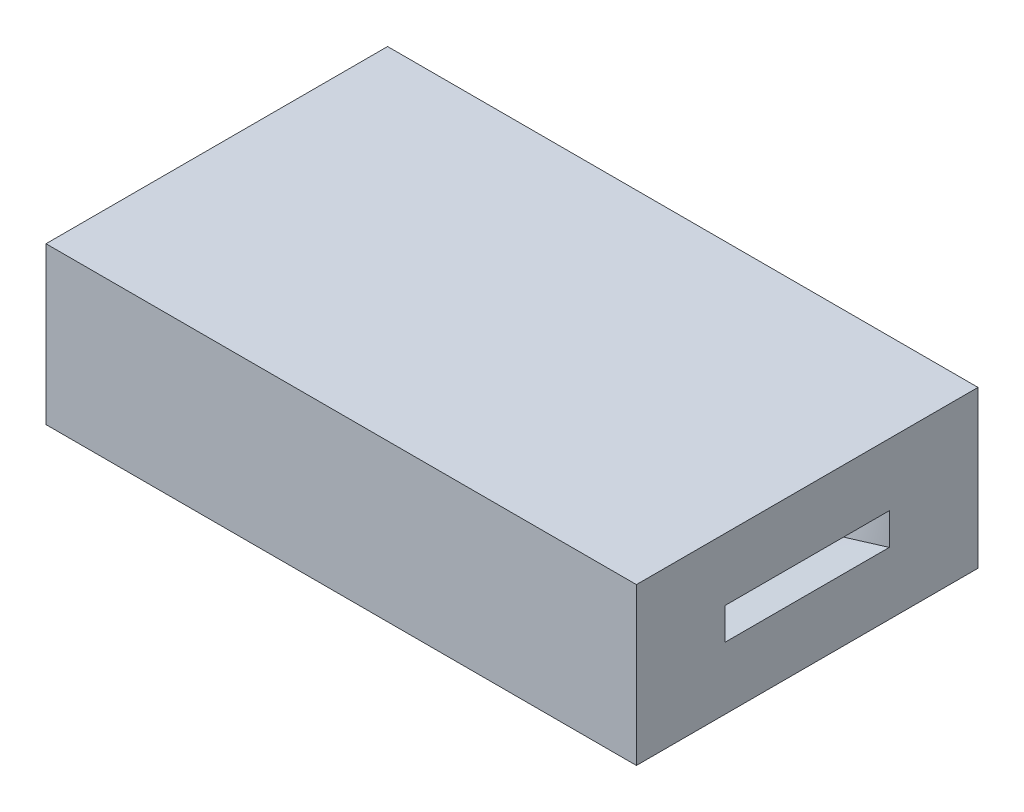
ISO-10303-21;
HEADER;
FILE_DESCRIPTION(('STEP AP214'),'2;1');
FILE_NAME('part.step','',(''),(''),'','','');
FILE_SCHEMA(('AUTOMOTIVE_DESIGN { 1 0 10303 214 1 1 1 1 }'));
ENDSEC;
DATA;
#1=APPLICATION_CONTEXT('core data for automotive mechanical design processes');
#2=APPLICATION_PROTOCOL_DEFINITION('international standard','automotive_design',2000,#1);
#3=PRODUCT_CONTEXT('',#1,'mechanical');
#4=PRODUCT('Part','Part','',(#3));
#5=PRODUCT_RELATED_PRODUCT_CATEGORY('part','',(#4));
#6=PRODUCT_DEFINITION_FORMATION('','',#4);
#7=PRODUCT_DEFINITION_CONTEXT('part definition',#1,'design');
#8=PRODUCT_DEFINITION('design','',#6,#7);
#9=PRODUCT_DEFINITION_SHAPE('','',#8);
#10=(LENGTH_UNIT() NAMED_UNIT(*) SI_UNIT(.MILLI.,.METRE.));
#11=(NAMED_UNIT(*) PLANE_ANGLE_UNIT() SI_UNIT($,.RADIAN.));
#12=(NAMED_UNIT(*) SI_UNIT($,.STERADIAN.) SOLID_ANGLE_UNIT());
#13=UNCERTAINTY_MEASURE_WITH_UNIT(LENGTH_MEASURE(1.E-05),#10,'distance_accuracy_value','');
#14=(GEOMETRIC_REPRESENTATION_CONTEXT(3) GLOBAL_UNCERTAINTY_ASSIGNED_CONTEXT((#13)) GLOBAL_UNIT_ASSIGNED_CONTEXT((#10,
#11,#12)) REPRESENTATION_CONTEXT('',''));
#15=CARTESIAN_POINT('',(0.,0.,0.));
#16=DIRECTION('',(0.,0.,1.));
#17=DIRECTION('',(1.,0.,0.));
#18=AXIS2_PLACEMENT_3D('',#15,#16,#17);
#19=CARTESIAN_POINT('',(95.7248486928691,25.4,-55.3815967513125));
#20=DIRECTION('',(-1.,0.,0.));
#21=DIRECTION('',(0.,0.,1.));
#22=AXIS2_PLACEMENT_3D('',#19,#20,#21);
#23=PLANE('',#22);
#24=DIRECTION('',(0.,-1.,0.));
#25=VECTOR('',#24,1.);
#26=CARTESIAN_POINT('',(95.7248486928691,5.159151432017,26.6237691183134));
#27=LINE('',#26,#25);
#28=CARTESIAN_POINT('',(95.7248486928691,5.159151432017,26.6237691183134));
#29=VERTEX_POINT('',#28);
#30=CARTESIAN_POINT('',(95.7248486928691,-5.159151432017,26.6237691183134));
#31=VERTEX_POINT('',#30);
#32=EDGE_CURVE('E111',#29,#31,#27,.T.);
#33=ORIENTED_EDGE('',*,*,#32,.F.);
#34=DIRECTION('',(0.,0.,1.));
#35=VECTOR('',#34,1.);
#36=CARTESIAN_POINT('',(95.7248486928691,5.159151432017,26.6237691183134));
#37=LINE('',#36,#35);
#38=CARTESIAN_POINT('',(95.7248486928691,5.159151432017,8.87458970610447));
#39=VERTEX_POINT('',#38);
#40=EDGE_CURVE('E266',#39,#29,#37,.T.);
#41=ORIENTED_EDGE('',*,*,#40,.F.);
#42=CARTESIAN_POINT('',(95.7248486928691,5.159151432017,-8.87458970610447));
#43=VERTEX_POINT('',#42);
#44=EDGE_CURVE('E256',#43,#39,#37,.T.);
#45=ORIENTED_EDGE('',*,*,#44,.F.);
#46=CARTESIAN_POINT('',(95.7248486928691,5.159151432017,-26.6237691183134));
#47=VERTEX_POINT('',#46);
#48=EDGE_CURVE('E222',#47,#43,#37,.T.);
#49=ORIENTED_EDGE('',*,*,#48,.F.);
#50=DIRECTION('',(0.,1.,0.));
#51=VECTOR('',#50,1.);
#52=CARTESIAN_POINT('',(95.7248486928691,5.159151432017,-26.6237691183134));
#53=LINE('',#52,#51);
#54=CARTESIAN_POINT('',(95.7248486928691,-5.159151432017,-26.6237691183134));
#55=VERTEX_POINT('',#54);
#56=EDGE_CURVE('E204',#55,#47,#53,.T.);
#57=ORIENTED_EDGE('',*,*,#56,.F.);
#58=DIRECTION('',(0.,0.,-1.));
#59=VECTOR('',#58,1.);
#60=CARTESIAN_POINT('',(95.7248486928691,-5.159151432017,26.6237691183134));
#61=LINE('',#60,#59);
#62=EDGE_CURVE('E194',#31,#55,#61,.T.);
#63=ORIENTED_EDGE('',*,*,#62,.F.);
#64=EDGE_LOOP('',(#33,#41,#45,#49,#57,#63));
#65=FACE_BOUND('',#64,.T.);
#66=DIRECTION('',(0.,0.,-1.));
#67=VECTOR('',#66,1.);
#68=CARTESIAN_POINT('',(95.7248486928691,-25.4,-55.3815967513125));
#69=LINE('',#68,#67);
#70=CARTESIAN_POINT('',(95.7248486928691,-25.4,55.3815967513125));
#71=VERTEX_POINT('',#70);
#72=CARTESIAN_POINT('',(95.7248486928691,-25.4,-55.3815967513125));
#73=VERTEX_POINT('',#72);
#74=EDGE_CURVE('E360',#71,#73,#69,.T.);
#75=ORIENTED_EDGE('',*,*,#74,.T.);
#76=DIRECTION('',(0.,-1.,0.));
#77=VECTOR('',#76,1.);
#78=CARTESIAN_POINT('',(95.7248486928691,25.4,-55.3815967513125));
#79=LINE('',#78,#77);
#80=CARTESIAN_POINT('',(95.7248486928691,25.4,-55.3815967513125));
#81=VERTEX_POINT('',#80);
#82=EDGE_CURVE('E12',#81,#73,#79,.T.);
#83=ORIENTED_EDGE('',*,*,#82,.F.);
#84=DIRECTION('',(0.,0.,-1.));
#85=VECTOR('',#84,1.);
#86=CARTESIAN_POINT('',(95.7248486928691,25.4,-55.3815967513125));
#87=LINE('',#86,#85);
#88=CARTESIAN_POINT('',(95.7248486928691,25.4,55.3815967513125));
#89=VERTEX_POINT('',#88);
#90=EDGE_CURVE('E373',#89,#81,#87,.T.);
#91=ORIENTED_EDGE('',*,*,#90,.F.);
#92=DIRECTION('',(0.,-1.,0.));
#93=VECTOR('',#92,1.);
#94=CARTESIAN_POINT('',(95.7248486928691,25.4,55.3815967513125));
#95=LINE('',#94,#93);
#96=EDGE_CURVE('E374',#89,#71,#95,.T.);
#97=ORIENTED_EDGE('',*,*,#96,.T.);
#98=EDGE_LOOP('',(#75,#83,#91,#97));
#99=FACE_BOUND('',#98,.T.);
#100=ADVANCED_FACE('F107',(#65,#99),#23,.F.);
#101=CARTESIAN_POINT('',(-95.7248486928691,25.4,-55.3815967513125));
#102=DIRECTION('',(0.,0.,1.));
#103=DIRECTION('',(1.,0.,0.));
#104=AXIS2_PLACEMENT_3D('',#101,#102,#103);
#105=PLANE('',#104);
#106=DIRECTION('',(-1.,0.,0.));
#107=VECTOR('',#106,1.);
#108=CARTESIAN_POINT('',(-95.7248486928691,-25.4,-55.3815967513125));
#109=LINE('',#108,#107);
#110=CARTESIAN_POINT('',(-95.7248486928691,-25.4,-55.3815967513125));
#111=VERTEX_POINT('',#110);
#112=EDGE_CURVE('E362',#73,#111,#109,.T.);
#113=ORIENTED_EDGE('',*,*,#112,.T.);
#114=DIRECTION('',(0.,-1.,0.));
#115=VECTOR('',#114,1.);
#116=CARTESIAN_POINT('',(-95.7248486928691,25.4,-55.3815967513125));
#117=LINE('',#116,#115);
#118=CARTESIAN_POINT('',(-95.7248486928691,25.4,-55.3815967513125));
#119=VERTEX_POINT('',#118);
#120=EDGE_CURVE('E117',#119,#111,#117,.T.);
#121=ORIENTED_EDGE('',*,*,#120,.F.);
#122=DIRECTION('',(-1.,0.,0.));
#123=VECTOR('',#122,1.);
#124=CARTESIAN_POINT('',(-95.7248486928691,25.4,-55.3815967513125));
#125=LINE('',#124,#123);
#126=EDGE_CURVE('E162',#81,#119,#125,.T.);
#127=ORIENTED_EDGE('',*,*,#126,.F.);
#128=ORIENTED_EDGE('',*,*,#82,.T.);
#129=EDGE_LOOP('',(#113,#121,#127,#128));
#130=FACE_BOUND('',#129,.T.);
#131=ADVANCED_FACE('F386',(#130),#105,.F.);
#132=CARTESIAN_POINT('',(-95.7248486928691,25.4,-55.3815967513125));
#133=DIRECTION('',(1.,0.,0.));
#134=DIRECTION('',(0.,0.,-1.));
#135=AXIS2_PLACEMENT_3D('',#132,#133,#134);
#136=PLANE('',#135);
#137=DIRECTION('',(0.,0.,1.));
#138=VECTOR('',#137,1.);
#139=CARTESIAN_POINT('',(-95.7248486928691,-25.4,-55.3815967513125));
#140=LINE('',#139,#138);
#141=CARTESIAN_POINT('',(-95.7248486928691,-25.4,55.3815967513125));
#142=VERTEX_POINT('',#141);
#143=EDGE_CURVE('E366',#111,#142,#140,.T.);
#144=ORIENTED_EDGE('',*,*,#143,.T.);
#145=DIRECTION('',(0.,-1.,0.));
#146=VECTOR('',#145,1.);
#147=CARTESIAN_POINT('',(-95.7248486928691,25.4,55.3815967513125));
#148=LINE('',#147,#146);
#149=CARTESIAN_POINT('',(-95.7248486928691,25.4,55.3815967513125));
#150=VERTEX_POINT('',#149);
#151=EDGE_CURVE('E376',#150,#142,#148,.T.);
#152=ORIENTED_EDGE('',*,*,#151,.F.);
#153=DIRECTION('',(0.,0.,1.));
#154=VECTOR('',#153,1.);
#155=CARTESIAN_POINT('',(-95.7248486928691,25.4,-55.3815967513125));
#156=LINE('',#155,#154);
#157=EDGE_CURVE('E384',#119,#150,#156,.T.);
#158=ORIENTED_EDGE('',*,*,#157,.F.);
#159=ORIENTED_EDGE('',*,*,#120,.T.);
#160=EDGE_LOOP('',(#144,#152,#158,#159));
#161=FACE_BOUND('',#160,.T.);
#162=ADVANCED_FACE('F382',(#161),#136,.F.);
#163=CARTESIAN_POINT('',(-95.7248486928691,25.4,55.3815967513125));
#164=DIRECTION('',(0.,0.,-1.));
#165=DIRECTION('',(-1.,0.,0.));
#166=AXIS2_PLACEMENT_3D('',#163,#164,#165);
#167=PLANE('',#166);
#168=DIRECTION('',(1.,0.,0.));
#169=VECTOR('',#168,1.);
#170=CARTESIAN_POINT('',(-95.7248486928691,-25.4,55.3815967513125));
#171=LINE('',#170,#169);
#172=EDGE_CURVE('E155',#142,#71,#171,.T.);
#173=ORIENTED_EDGE('',*,*,#172,.T.);
#174=ORIENTED_EDGE('',*,*,#96,.F.);
#175=DIRECTION('',(1.,0.,0.));
#176=VECTOR('',#175,1.);
#177=CARTESIAN_POINT('',(-95.7248486928691,25.4,55.3815967513125));
#178=LINE('',#177,#176);
#179=EDGE_CURVE('E134',#150,#89,#178,.T.);
#180=ORIENTED_EDGE('',*,*,#179,.F.);
#181=ORIENTED_EDGE('',*,*,#151,.T.);
#182=EDGE_LOOP('',(#173,#174,#180,#181));
#183=FACE_BOUND('',#182,.T.);
#184=ADVANCED_FACE('F392',(#183),#167,.F.);
#185=CARTESIAN_POINT('',(0.,25.4,0.));
#186=DIRECTION('',(0.,1.,0.));
#187=DIRECTION('',(0.,0.,1.));
#188=AXIS2_PLACEMENT_3D('',#185,#186,#187);
#189=PLANE('',#188);
#190=ORIENTED_EDGE('',*,*,#90,.T.);
#191=ORIENTED_EDGE('',*,*,#126,.T.);
#192=ORIENTED_EDGE('',*,*,#157,.T.);
#193=ORIENTED_EDGE('',*,*,#179,.T.);
#194=EDGE_LOOP('',(#190,#191,#192,#193));
#195=FACE_BOUND('',#194,.T.);
#196=ADVANCED_FACE('F307',(#195),#189,.T.);
#197=CARTESIAN_POINT('',(0.,-25.4,0.));
#198=DIRECTION('',(0.,1.,0.));
#199=DIRECTION('',(0.,0.,1.));
#200=AXIS2_PLACEMENT_3D('',#197,#198,#199);
#201=PLANE('',#200);
#202=ORIENTED_EDGE('',*,*,#74,.F.);
#203=ORIENTED_EDGE('',*,*,#172,.F.);
#204=ORIENTED_EDGE('',*,*,#143,.F.);
#205=ORIENTED_EDGE('',*,*,#112,.F.);
#206=EDGE_LOOP('',(#202,#203,#204,#205));
#207=FACE_BOUND('',#206,.T.);
#208=ADVANCED_FACE('F302',(#207),#201,.F.);
#209=CARTESIAN_POINT('',(-94.7751513071309,11.9806961032404,40.2159038787155));
#210=DIRECTION('',(1.,0.,0.));
#211=DIRECTION('',(0.,0.,-1.));
#212=AXIS2_PLACEMENT_3D('',#209,#210,#211);
#213=PLANE('',#212);
#214=CARTESIAN_POINT('',(-94.7751513071309,11.9806961032404,40.2159038787155));
#215=DIRECTION('',(1.,0.,0.));
#216=DIRECTION('',(0.,0.,-1.));
#217=AXIS2_PLACEMENT_3D('',#214,#215,#216);
#218=CIRCLE('',#217,6.585879729267);
#219=CARTESIAN_POINT('',(-94.7751513071309,6.27715695142615,43.508843743349));
#220=VERTEX_POINT('',#219);
#221=CARTESIAN_POINT('',(-94.7751513071309,6.2771569514262,36.922964014082));
#222=VERTEX_POINT('',#221);
#223=EDGE_CURVE('E283',#220,#222,#218,.T.);
#224=ORIENTED_EDGE('',*,*,#223,.T.);
#225=CARTESIAN_POINT('',(-94.7751513071309,11.9806961032404,33.6300241494485));
#226=VERTEX_POINT('',#225);
#227=EDGE_CURVE('E215',#222,#226,#218,.T.);
#228=ORIENTED_EDGE('',*,*,#227,.T.);
#229=CARTESIAN_POINT('',(-94.7751513071309,17.6842352550546,36.9229640140821));
#230=VERTEX_POINT('',#229);
#231=EDGE_CURVE('E355',#226,#230,#218,.T.);
#232=ORIENTED_EDGE('',*,*,#231,.T.);
#233=CARTESIAN_POINT('',(-94.7751513071309,17.6842352550546,43.5088437433491));
#234=VERTEX_POINT('',#233);
#235=EDGE_CURVE('E342',#230,#234,#218,.T.);
#236=ORIENTED_EDGE('',*,*,#235,.T.);
#237=CARTESIAN_POINT('',(-94.7751513071309,11.9806961032403,46.8017836079825));
#238=VERTEX_POINT('',#237);
#239=EDGE_CURVE('E335',#234,#238,#218,.T.);
#240=ORIENTED_EDGE('',*,*,#239,.T.);
#241=EDGE_CURVE('E288',#238,#220,#218,.T.);
#242=ORIENTED_EDGE('',*,*,#241,.T.);
#243=EDGE_LOOP('',(#224,#228,#232,#236,#240,#242));
#244=FACE_BOUND('',#243,.T.);
#245=ADVANCED_FACE('F291',(#244),#213,.T.);
#246=CARTESIAN_POINT('',(95.7248486928691,5.159151432017,26.6237691183134));
#247=CARTESIAN_POINT('',(73.2302632375958,2.52563135286009,12.8718801320934));
#248=CARTESIAN_POINT('',(27.5816028880022,-0.51370347737699,-2.59539173212036));
#249=CARTESIAN_POINT('',(-26.5563449763867,-2.76068678790735,57.4536383632836));
#250=CARTESIAN_POINT('',(-72.1946886143923,5.8569759213813,52.5897458741239));
#251=CARTESIAN_POINT('',(-94.7751513071309,11.9806961032403,46.8017836079825));
#252=CARTESIAN_POINT('',(95.7248486928691,5.159151432017,20.7073759809104));
#253=CARTESIAN_POINT('',(73.0470488740217,4.42805209527357,8.95736536923384));
#254=CARTESIAN_POINT('',(27.6891804740498,3.99100070051582,-3.8816478274096));
#255=CARTESIAN_POINT('',(-26.6215651701827,-2.63825980489723,57.6605312868024));
#256=CARTESIAN_POINT('',(-72.1201387687945,7.47972383553392,52.8570321438918));
#257=CARTESIAN_POINT('',(-94.7751513071309,14.3332607943175,46.8017836079825));
#258=CARTESIAN_POINT('',(95.7248486928691,5.159151432017,14.7909828435075));
#259=CARTESIAN_POINT('',(72.8638345104476,6.33047283768706,5.04285060637425));
#260=CARTESIAN_POINT('',(27.7967580600974,8.48944826279553,-4.90561464328203));
#261=CARTESIAN_POINT('',(-26.6867853639787,-2.49220909340378,56.8770723804829));
#262=CARTESIAN_POINT('',(-72.0455889231967,8.92459917380786,51.8687593355454));
#263=CARTESIAN_POINT('',(-94.7751513071309,16.507952909516,45.5462245298682));
#264=CARTESIAN_POINT('',(95.7248486928691,5.159151432017,8.87458970610447));
#265=CARTESIAN_POINT('',(72.6806201468734,8.23289358010054,1.12833584351467));
#266=CARTESIAN_POINT('',(27.9043356461451,12.9667732565442,-5.67644782908922));
#267=CARTESIAN_POINT('',(-26.7520055577746,-2.26640379017813,55.1378315440512));
#268=CARTESIAN_POINT('',(-71.9710390775989,9.37106474242191,50.0986648187942));
#269=CARTESIAN_POINT('',(-94.7751513071309,17.6842352550546,43.5088437433491));
#270=B_SPLINE_SURFACE_WITH_KNOTS('',3,3,((#246,#247,#248,#249,#250,#251),(#252,#253,#254,#255,
#256,#257),(#258,#259,#260,#261,#262,#263),(#264,#265,#266,#267,#268,#269)),.UNSPECIFIED.,.F.,
.F.,.F.,(4,4),(4,1,1,4),(0.,1.),(0.,0.320268690334099,0.680755276396484,1.),.UNSPECIFIED.);
#271=CARTESIAN_POINT('',(95.7248486928691,5.159151432017,26.6237691183134));
#272=CARTESIAN_POINT('',(73.2302632375958,2.52563135286009,12.8718801320934));
#273=CARTESIAN_POINT('',(27.5816028880022,-0.51370347737699,-2.59539173212036));
#274=CARTESIAN_POINT('',(-26.5563449763867,-2.76068678790735,57.4536383632836));
#275=CARTESIAN_POINT('',(-72.1946886143923,5.8569759213813,52.5897458741239));
#276=CARTESIAN_POINT('',(-94.7751513071309,11.9806961032403,46.8017836079825));
#277=B_SPLINE_CURVE_WITH_KNOTS('',3,(#271,#272,#273,#274,#275,#276),.UNSPECIFIED.,.F.,.F.,(4,1,
1,4),(0.,0.320268690334099,0.680755276396484,1.),.UNSPECIFIED.);
#278=EDGE_CURVE('E627',#238,#29,#277,.F.);
#279=CARTESIAN_POINT('',(95.7248486928691,5.159151432017,8.87458970610447));
#280=CARTESIAN_POINT('',(72.6806201468734,8.23289358010054,1.12833584351467));
#281=CARTESIAN_POINT('',(27.9043356461451,12.9667732565442,-5.67644782908922));
#282=CARTESIAN_POINT('',(-26.7520055577746,-2.26640379017813,55.1378315440512));
#283=CARTESIAN_POINT('',(-71.9710390775989,9.37106474242191,50.0986648187942));
#284=CARTESIAN_POINT('',(-94.7751513071309,17.6842352550546,43.5088437433491));
#285=B_SPLINE_CURVE_WITH_KNOTS('',3,(#279,#280,#281,#282,#283,#284),.UNSPECIFIED.,.F.,.F.,(4,1,
1,4),(0.,0.320268690334099,0.680755276396484,1.),.UNSPECIFIED.);
#286=EDGE_CURVE('E635',#39,#234,#285,.T.);
#287=ORIENTED_EDGE('',*,*,#40,.T.);
#288=ORIENTED_EDGE('',*,*,#278,.F.);
#289=ORIENTED_EDGE('',*,*,#239,.F.);
#290=ORIENTED_EDGE('',*,*,#286,.F.);
#291=EDGE_LOOP('',(#287,#288,#289,#290));
#292=FACE_BOUND('',#291,.T.);
#293=ADVANCED_FACE('F301',(#292),#270,.F.);
#294=CARTESIAN_POINT('',(95.7248486928691,5.159151432017,8.87458970610447));
#295=CARTESIAN_POINT('',(72.6806201468735,8.23289358010054,1.12833584351467));
#296=CARTESIAN_POINT('',(27.9043356461451,12.9667732565442,-5.67644782908921));
#297=CARTESIAN_POINT('',(-26.7520055577746,-2.26640379017813,55.1378315440512));
#298=CARTESIAN_POINT('',(-71.9710390775988,9.37106474242191,50.0986648187942));
#299=CARTESIAN_POINT('',(-94.7751513071309,17.6842352550546,43.5088437433491));
#300=CARTESIAN_POINT('',(95.7248486928691,5.159151432017,8.1350405639291));
#301=CARTESIAN_POINT('',(72.6931418450993,8.19084358040576,0.549704656624653));
#302=CARTESIAN_POINT('',(27.8963831572189,12.8779795028328,-6.02148573032409));
#303=CARTESIAN_POINT('',(-26.7452820678694,-1.85287915885874,54.5337717534213));
#304=CARTESIAN_POINT('',(-71.9803969913039,9.63396116588816,49.6823604755253));
#305=CARTESIAN_POINT('',(-94.7751513071309,17.8312705482469,43.2541711450342));
#306=CARTESIAN_POINT('',(95.7248486928691,5.159151432017,6.65594227957835));
#307=CARTESIAN_POINT('',(72.7181852415511,8.10674358101617,-0.60755771715537));
#308=CARTESIAN_POINT('',(27.8804781793665,12.7264492503268,-6.64940204322171));
#309=CARTESIAN_POINT('',(-26.731835088059,-1.12421687621675,53.0909503788727));
#310=CARTESIAN_POINT('',(-71.9991128187141,10.1229951895226,48.8349474961841));
#311=CARTESIAN_POINT('',(-94.775151307131,18.0885823113335,42.730021655601));
#312=CARTESIAN_POINT('',(95.7248486928692,5.159151432017,3.69774571087687));
#313=CARTESIAN_POINT('',(72.8080337091685,7.98939605031039,-2.85684804935421));
#314=CARTESIAN_POINT('',(27.8208080473268,12.4942398516249,-7.80045162561089));
#315=CARTESIAN_POINT('',(-26.6737451755497,-0.0290509373913596,49.6882632644053));
#316=CARTESIAN_POINT('',(-72.0847819546057,10.8276194227365,46.8037093472007));
#317=CARTESIAN_POINT('',(-94.775151307131,18.4561705443143,41.6373097983243));
#318=CARTESIAN_POINT('',(95.724848692869,5.159151432017,0.));
#319=CARTESIAN_POINT('',(72.9625000500144,7.92207061558277,-5.59288275477464));
#320=CARTESIAN_POINT('',(27.7153174842719,12.3701612112965,-9.02608113226921));
#321=CARTESIAN_POINT('',(-26.5629036314654,0.564741233849042,44.4893151317327));
#322=CARTESIAN_POINT('',(-72.2527075017134,11.2188329691673,43.8726534901086));
#323=CARTESIAN_POINT('',(-94.7751513071308,18.6399646608046,40.2159038787156));
#324=CARTESIAN_POINT('',(95.7248486928691,5.159151432017,-3.69774571087686));
#325=CARTESIAN_POINT('',(73.1053030222206,7.98953846576187,-8.32479316395315));
#326=CARTESIAN_POINT('',(27.6138023106918,12.4977068588827,-10.2535725584643));
#327=CARTESIAN_POINT('',(-26.4453662406393,-0.0424067053739371,39.2897217096951));
#328=CARTESIAN_POINT('',(-72.4362937781144,10.8531433326955,40.9507696504797));
#329=CARTESIAN_POINT('',(-94.7751513071309,18.4561705443143,38.7944979591069));
#330=CARTESIAN_POINT('',(95.7248486928691,5.159151432017,-6.65594227957835));
#331=CARTESIAN_POINT('',(73.1786485300906,8.1103008321693,-10.5697121864774));
#332=CARTESIAN_POINT('',(27.5595507590696,12.7298735838444,-11.4047677831417));
#333=CARTESIAN_POINT('',(-26.3770229565467,-1.14376669950061,35.87944928188));
#334=CARTESIAN_POINT('',(-72.5455876255274,10.1607674815816,38.9309253510179));
#335=CARTESIAN_POINT('',(-94.7751513071309,18.0885823113335,37.7017861018302));
#336=CARTESIAN_POINT('',(95.7248486928691,5.159151432017,-8.1350405639291));
#337=CARTESIAN_POINT('',(73.1938930012916,8.19713822941574,-11.7258265899378));
#338=CARTESIAN_POINT('',(27.5470828701078,12.8802463182917,-12.0324519606833));
#339=CARTESIAN_POINT('',(-26.3583174386226,-1.87315286213877,34.4336149795696));
#340=CARTESIAN_POINT('',(-72.5767704500277,9.67375360188165,38.090113326036));
#341=CARTESIAN_POINT('',(-94.7751513071309,17.8312705482469,37.177636612397));
#342=CARTESIAN_POINT('',(95.7248486928691,5.159151432017,-8.87458970610447));
#343=CARTESIAN_POINT('',(73.201515236892,8.24055692803895,-12.3038837916679));
#344=CARTESIAN_POINT('',(27.5408489256269,12.9684570276519,-12.3773293437809));
#345=CARTESIAN_POINT('',(-26.3489646796605,-2.28702325293836,33.8278808890202));
#346=CARTESIAN_POINT('',(-72.5923618622779,9.41186725038261,37.6771094599468));
#347=CARTESIAN_POINT('',(-94.7751513071309,17.6842352550546,36.9229640140821));
#348=B_SPLINE_SURFACE_WITH_KNOTS('',3,3,((#294,#295,#296,#297,#298,#299),(#300,#301,#302,#303,
#304,#305),(#306,#307,#308,#309,#310,#311),(#312,#313,#314,#315,#316,#317),(#318,#319,#320,#321,
#322,#323),(#324,#325,#326,#327,#328,#329),(#330,#331,#332,#333,#334,#335),(#336,#337,#338,#339,
#340,#341),(#342,#343,#344,#345,#346,#347)),.UNSPECIFIED.,.F.,.F.,.F.,(4,1,1,1,1,1,4),(4,1,1,4),
(0.,0.125,0.25,0.5,0.75,0.875,1.),(0.,0.320268690334099,0.680755276396484,1.),.UNSPECIFIED.);
#349=CARTESIAN_POINT('',(95.7248486928691,5.159151432017,-8.87458970610447));
#350=CARTESIAN_POINT('',(73.201515236892,8.24055692803895,-12.3038837916679));
#351=CARTESIAN_POINT('',(27.5408489256269,12.9684570276519,-12.3773293437809));
#352=CARTESIAN_POINT('',(-26.3489646796605,-2.28702325293836,33.8278808890202));
#353=CARTESIAN_POINT('',(-72.5923618622779,9.41186725038261,37.6771094599468));
#354=CARTESIAN_POINT('',(-94.7751513071309,17.6842352550546,36.9229640140821));
#355=B_SPLINE_CURVE_WITH_KNOTS('',3,(#349,#350,#351,#352,#353,#354),.UNSPECIFIED.,.F.,.F.,(4,1,
1,4),(0.,0.320268690334099,0.680755276396484,1.),.UNSPECIFIED.);
#356=EDGE_CURVE('E637',#43,#230,#355,.T.);
#357=ORIENTED_EDGE('',*,*,#44,.T.);
#358=ORIENTED_EDGE('',*,*,#286,.T.);
#359=ORIENTED_EDGE('',*,*,#235,.F.);
#360=ORIENTED_EDGE('',*,*,#356,.F.);
#361=EDGE_LOOP('',(#357,#358,#359,#360));
#362=FACE_BOUND('',#361,.T.);
#363=ADVANCED_FACE('F452',(#362),#348,.F.);
#364=CARTESIAN_POINT('',(95.7248486928691,-5.159151432017,26.6237691183134));
#365=CARTESIAN_POINT('',(73.1359684759744,-8.23959261172121,9.67606234724748));
#366=CARTESIAN_POINT('',(27.680128429039,-11.3220985575227,-10.210857469275));
#367=CARTESIAN_POINT('',(-26.7528703584076,-3.93109150326393,56.3511014476379));
#368=CARTESIAN_POINT('',(-71.8497658629531,2.285773763041,50.0622694595644));
#369=CARTESIAN_POINT('',(-94.7751513071309,6.27715695142615,43.508843743349));
#370=CARTESIAN_POINT('',(95.7248486928691,-1.71971714400567,26.6237691183134));
#371=CARTESIAN_POINT('',(73.1674000631815,-4.65118462352744,10.7413349421961));
#372=CARTESIAN_POINT('',(27.6472865820268,-7.73546744836589,-7.92855440340588));
#373=CARTESIAN_POINT('',(-26.687361897734,-3.4799122941625,57.6859189828741));
#374=CARTESIAN_POINT('',(-71.9647401134329,2.75127711075494,51.8444957627255));
#375=CARTESIAN_POINT('',(-94.7751513071309,7.45343929696471,45.5462245298681));
#376=CARTESIAN_POINT('',(95.7248486928691,1.71971714400567,26.6237691183134));
#377=CARTESIAN_POINT('',(73.1988316503887,-1.06277663533368,11.8066075371448));
#378=CARTESIAN_POINT('',(27.6144447350145,-4.12771377067799,-5.39311770747154));
#379=CARTESIAN_POINT('',(-26.6218534370603,-3.10848767679326,58.064954587998));
#380=CARTESIAN_POINT('',(-72.0797143639126,4.21519022812877,52.8449003574819));
#381=CARTESIAN_POINT('',(-94.7751513071309,9.62813141216318,46.8017836079825));
#382=CARTESIAN_POINT('',(95.7248486928691,5.159151432017,26.6237691183134));
#383=CARTESIAN_POINT('',(73.2302632375958,2.52563135286009,12.8718801320934));
#384=CARTESIAN_POINT('',(27.5816028880022,-0.513703477376989,-2.59539173212036));
#385=CARTESIAN_POINT('',(-26.5563449763867,-2.76068678790735,57.4536383632836));
#386=CARTESIAN_POINT('',(-72.1946886143923,5.8569759213813,52.5897458741239));
#387=CARTESIAN_POINT('',(-94.7751513071309,11.9806961032403,46.8017836079825));
#388=B_SPLINE_SURFACE_WITH_KNOTS('',3,3,((#364,#365,#366,#367,#368,#369),(#370,#371,#372,#373,
#374,#375),(#376,#377,#378,#379,#380,#381),(#382,#383,#384,#385,#386,#387)),.UNSPECIFIED.,.F.,
.F.,.F.,(4,4),(4,1,1,4),(0.,1.),(0.,0.320268690334099,0.680755276396484,1.),.UNSPECIFIED.);
#389=CARTESIAN_POINT('',(95.7248486928691,-5.159151432017,26.6237691183134));
#390=CARTESIAN_POINT('',(73.1359684759744,-8.23959261172121,9.67606234724746));
#391=CARTESIAN_POINT('',(27.680128429039,-11.3220985575227,-10.210857469275));
#392=CARTESIAN_POINT('',(-26.7528703584077,-3.93109150326393,56.3511014476379));
#393=CARTESIAN_POINT('',(-71.8497658629531,2.285773763041,50.0622694595643));
#394=CARTESIAN_POINT('',(-94.7751513071309,6.27715695142615,43.508843743349));
#395=B_SPLINE_CURVE_WITH_KNOTS('',3,(#389,#390,#391,#392,#393,#394),.UNSPECIFIED.,.F.,.F.,(4,1,
1,4),(0.,0.320268690334099,0.680755276396484,1.),.UNSPECIFIED.);
#396=EDGE_CURVE('E125',#31,#220,#395,.T.);
#397=ORIENTED_EDGE('',*,*,#32,.T.);
#398=ORIENTED_EDGE('',*,*,#396,.T.);
#399=ORIENTED_EDGE('',*,*,#241,.F.);
#400=ORIENTED_EDGE('',*,*,#278,.T.);
#401=EDGE_LOOP('',(#397,#398,#399,#400));
#402=FACE_BOUND('',#401,.T.);
#403=ADVANCED_FACE('F463',(#402),#388,.F.);
#404=CARTESIAN_POINT('',(95.7248486928691,5.159151432017,-8.87458970610447));
#405=CARTESIAN_POINT('',(73.201515236892,8.24055692803895,-12.3038837916679));
#406=CARTESIAN_POINT('',(27.540848925627,12.9684570276519,-12.3773293437809));
#407=CARTESIAN_POINT('',(-26.3489646796605,-2.28702325293837,33.8278808890202));
#408=CARTESIAN_POINT('',(-72.5923618622779,9.41186725038261,37.6771094599468));
#409=CARTESIAN_POINT('',(-94.7751513071309,17.6842352550546,36.9229640140821));
#410=CARTESIAN_POINT('',(95.7248486928691,5.159151432017,-14.7909828435075));
#411=CARTESIAN_POINT('',(73.2650097449931,6.33777180995621,-16.2948492434982));
#412=CARTESIAN_POINT('',(27.5198159160141,8.48998110155549,-13.1086050253216));
#413=CARTESIAN_POINT('',(-26.3877147512519,-2.50780474430262,32.0815574505969));
#414=CARTESIAN_POINT('',(-72.5027823533103,8.95585524921803,35.9002505638373));
#415=CARTESIAN_POINT('',(-94.7751513071309,16.507952909516,34.8855832275629));
#416=CARTESIAN_POINT('',(95.7248486928691,5.159151432017,-20.7073759809104));
#417=CARTESIAN_POINT('',(73.3285042530942,4.43498669187348,-20.2858146953284));
#418=CARTESIAN_POINT('',(27.4987829064013,3.99038260692802,-14.0930143369276));
#419=CARTESIAN_POINT('',(-26.4264648228434,-2.64883164393468,31.2910159422858));
#420=CARTESIAN_POINT('',(-72.4132028443427,7.50143347839355,34.9052133761325));
#421=CARTESIAN_POINT('',(-94.7751513071309,14.3332607943175,33.6300241494485));
#422=CARTESIAN_POINT('',(95.7248486928691,5.159151432017,-26.6237691183134));
#423=CARTESIAN_POINT('',(73.3919987611953,2.53220157379074,-24.2767801471586));
#424=CARTESIAN_POINT('',(27.4777498967885,-0.51547250331254,-15.3397129279504));
#425=CARTESIAN_POINT('',(-26.4652148944348,-2.76623481508342,31.4908262638131));
#426=CARTESIAN_POINT('',(-72.3236233353751,5.86913913169038,35.1657352665421));
#427=CARTESIAN_POINT('',(-94.7751513071309,11.9806961032404,33.6300241494485));
#428=B_SPLINE_SURFACE_WITH_KNOTS('',3,3,((#404,#405,#406,#407,#408,#409),(#410,#411,#412,#413,
#414,#415),(#416,#417,#418,#419,#420,#421),(#422,#423,#424,#425,#426,#427)),.UNSPECIFIED.,.F.,
.F.,.F.,(4,4),(4,1,1,4),(0.,1.),(0.,0.320268690334099,0.680755276396484,1.),.UNSPECIFIED.);
#429=CARTESIAN_POINT('',(95.7248486928691,5.159151432017,-26.6237691183134));
#430=CARTESIAN_POINT('',(73.3919987611953,2.53220157379074,-24.2767801471586));
#431=CARTESIAN_POINT('',(27.4777498967885,-0.51547250331254,-15.3397129279504));
#432=CARTESIAN_POINT('',(-26.4652148944348,-2.76623481508342,31.4908262638131));
#433=CARTESIAN_POINT('',(-72.3236233353751,5.86913913169038,35.1657352665421));
#434=CARTESIAN_POINT('',(-94.7751513071309,11.9806961032404,33.6300241494485));
#435=B_SPLINE_CURVE_WITH_KNOTS('',3,(#429,#430,#431,#432,#433,#434),.UNSPECIFIED.,.F.,.F.,(4,1,
1,4),(0.,0.320268690334099,0.680755276396484,1.),.UNSPECIFIED.);
#436=EDGE_CURVE('E217',#47,#226,#435,.T.);
#437=ORIENTED_EDGE('',*,*,#48,.T.);
#438=ORIENTED_EDGE('',*,*,#356,.T.);
#439=ORIENTED_EDGE('',*,*,#231,.F.);
#440=ORIENTED_EDGE('',*,*,#436,.F.);
#441=EDGE_LOOP('',(#437,#438,#439,#440));
#442=FACE_BOUND('',#441,.T.);
#443=ADVANCED_FACE('F474',(#442),#428,.F.);
#444=CARTESIAN_POINT('',(95.7248486928691,5.159151432017,-26.6237691183134));
#445=CARTESIAN_POINT('',(73.3919987611953,2.53220157379074,-24.2767801471586));
#446=CARTESIAN_POINT('',(27.4777498967885,-0.515472503312539,-15.3397129279504));
#447=CARTESIAN_POINT('',(-26.4652148944348,-2.76623481508342,31.4908262638131));
#448=CARTESIAN_POINT('',(-72.3236233353751,5.86913913169038,35.1657352665421));
#449=CARTESIAN_POINT('',(-94.7751513071309,11.9806961032404,33.6300241494485));
#450=CARTESIAN_POINT('',(95.7248486928691,1.71971714400567,-26.6237691183134));
#451=CARTESIAN_POINT('',(73.5287946825792,-1.06166457630631,-23.2669290703932));
#452=CARTESIAN_POINT('',(27.3985179642854,-4.12359635287197,-12.5153301437218));
#453=CARTESIAN_POINT('',(-26.4206351357039,-3.12610382082383,30.8820015255413));
#454=CARTESIAN_POINT('',(-72.3715416378378,4.24862155270832,34.8913314093011));
#455=CARTESIAN_POINT('',(-94.7751513071309,9.62813141216324,33.6300241494485));
#456=CARTESIAN_POINT('',(95.7248486928691,-1.71971714400567,-26.6237691183134));
#457=CARTESIAN_POINT('',(73.665590603963,-4.65553072640336,-22.2570779936279));
#458=CARTESIAN_POINT('',(27.3192860317822,-7.7254635868183,-9.95323663890993));
#459=CARTESIAN_POINT('',(-26.376055376973,-3.50959655504757,31.2635286171079));
#460=CARTESIAN_POINT('',(-72.4194599403005,2.80597654960495,35.8724866301746));
#461=CARTESIAN_POINT('',(-94.7751513071309,7.45343929696479,34.8855832275629));
#462=CARTESIAN_POINT('',(95.7248486928691,-5.159151432017,-26.6237691183134));
#463=CARTESIAN_POINT('',(73.8023865253468,-8.24939687650041,-21.2472269168625));
#464=CARTESIAN_POINT('',(27.2400540992791,-11.3062082522336,-7.64427676416332));
#465=CARTESIAN_POINT('',(-26.3314756182421,-3.97284388100352,32.6008376387865));
#466=CARTESIAN_POINT('',(-72.4673782427631,2.36174131616144,37.6354635594527));
#467=CARTESIAN_POINT('',(-94.7751513071309,6.27715695142621,36.922964014082));
#468=B_SPLINE_SURFACE_WITH_KNOTS('',3,3,((#444,#445,#446,#447,#448,#449),(#450,#451,#452,#453,
#454,#455),(#456,#457,#458,#459,#460,#461),(#462,#463,#464,#465,#466,#467)),.UNSPECIFIED.,.F.,
.F.,.F.,(4,4),(4,1,1,4),(0.,1.),(0.,0.320268690334099,0.680755276396484,1.),.UNSPECIFIED.);
#469=CARTESIAN_POINT('',(95.7248486928691,-5.159151432017,-26.6237691183134));
#470=CARTESIAN_POINT('',(73.8023865253468,-8.24939687650041,-21.2472269168625));
#471=CARTESIAN_POINT('',(27.2400540992791,-11.3062082522336,-7.64427676416332));
#472=CARTESIAN_POINT('',(-26.3314756182421,-3.97284388100352,32.6008376387865));
#473=CARTESIAN_POINT('',(-72.4673782427631,2.36174131616144,37.6354635594527));
#474=CARTESIAN_POINT('',(-94.7751513071309,6.27715695142621,36.922964014082));
#475=B_SPLINE_CURVE_WITH_KNOTS('',3,(#469,#470,#471,#472,#473,#474),.UNSPECIFIED.,.F.,.F.,(4,1,
1,4),(0.,0.320268690334099,0.680755276396484,1.),.UNSPECIFIED.);
#476=EDGE_CURVE('E198',#55,#222,#475,.T.);
#477=ORIENTED_EDGE('',*,*,#56,.T.);
#478=ORIENTED_EDGE('',*,*,#436,.T.);
#479=ORIENTED_EDGE('',*,*,#227,.F.);
#480=ORIENTED_EDGE('',*,*,#476,.F.);
#481=EDGE_LOOP('',(#477,#478,#479,#480));
#482=FACE_BOUND('',#481,.T.);
#483=ADVANCED_FACE('F211',(#482),#468,.F.);
#484=CARTESIAN_POINT('',(95.7248486928691,-5.159151432017,-26.6237691183134));
#485=CARTESIAN_POINT('',(73.8023865253469,-8.24939687650041,-21.2472269168625));
#486=CARTESIAN_POINT('',(27.2400540992791,-11.3062082522336,-7.64427676416331));
#487=CARTESIAN_POINT('',(-26.3314756182421,-3.97284388100352,32.6008376387865));
#488=CARTESIAN_POINT('',(-72.4673782427631,2.36174131616145,37.6354635594527));
#489=CARTESIAN_POINT('',(-94.7751513071309,6.27715695142621,36.922964014082));
#490=CARTESIAN_POINT('',(95.7248486928691,-5.159151432017,-24.4051216917873));
#491=CARTESIAN_POINT('',(73.7127860736302,-8.20380671299574,-19.903342645313));
#492=CARTESIAN_POINT('',(27.2886649805888,-11.2194145528688,-7.70481521464198));
#493=CARTESIAN_POINT('',(-26.3482695833654,-4.38540513214418,33.3120976841079));
#494=CARTESIAN_POINT('',(-72.4593290126089,2.09796280802124,38.0511813140337));
#495=CARTESIAN_POINT('',(-94.7751513071309,6.13012165823388,37.1776366123969));
#496=CARTESIAN_POINT('',(95.7248486928691,-5.159151432017,-19.9678268387351));
#497=CARTESIAN_POINT('',(73.5335851701968,-8.11262638598641,-17.2155741022138));
#498=CARTESIAN_POINT('',(27.3858867432084,-11.071884409056,-7.88805160517149));
#499=CARTESIAN_POINT('',(-26.3818575136121,-5.11214065442874,34.9693195680396));
#500=CARTESIAN_POINT('',(-72.4432305523003,1.60716461503891,38.8974211159991));
#501=CARTESIAN_POINT('',(-94.775151307131,5.87280989514731,37.7017861018301));
#502=CARTESIAN_POINT('',(95.7248486928692,-5.159151432017,-11.0932371326306));
#503=CARTESIAN_POINT('',(73.2212524248035,-7.98944398625415,-11.9718299334994));
#504=CARTESIAN_POINT('',(27.5635630009171,-10.8435225199734,-8.32429793456039));
#505=CARTESIAN_POINT('',(-26.4714603922956,-6.20363815471758,38.7924876093302));
#506=CARTESIAN_POINT('',(-72.3567393836381,0.897172549774811,40.9244757213489));
#507=CARTESIAN_POINT('',(-94.775151307131,5.5052216621665,38.7944979591068));
#508=CARTESIAN_POINT('',(95.724848692869,-5.159151432017,0.));
#509=CARTESIAN_POINT('',(72.9177219197563,-7.92215959037447,-5.5743415928531));
#510=CARTESIAN_POINT('',(27.7482390558673,-10.7204689595599,-9.03921595893105));
#511=CARTESIAN_POINT('',(-26.6038745212364,-6.79348345395591,44.5044035639542));
#512=CARTESIAN_POINT('',(-72.1873997268143,0.498523446871365,43.8526230840075));
#513=CARTESIAN_POINT('',(-94.7751513071308,5.32142754567606,40.2159038787154));
#514=CARTESIAN_POINT('',(95.7248486928691,-5.159151432017,11.0932371326306));
#515=CARTESIAN_POINT('',(72.8263348844279,-7.9892236058081,0.734430564302234));
#516=CARTESIAN_POINT('',(27.8220189010855,-10.8493173895063,-9.70640454334893));
#517=CARTESIAN_POINT('',(-26.7123765343667,-6.18216802624,50.2012080315129));
#518=CARTESIAN_POINT('',(-72.0073006707654,0.856479401785351,46.7790125615187));
#519=CARTESIAN_POINT('',(-94.7751513071309,5.50522166216647,41.6373097983242));
#520=CARTESIAN_POINT('',(95.7248486928691,-5.159151432017,19.9678268387351));
#521=CARTESIAN_POINT('',(72.9279254735696,-8.10790809782245,5.81476291605189));
#522=CARTESIAN_POINT('',(27.7832817602186,-11.0835205618404,-10.0567999414949));
#523=CARTESIAN_POINT('',(-26.755178092389,-5.07698584422482,54.004337833888));
#524=CARTESIAN_POINT('',(-71.9000895439566,1.54221101076637,48.8048490176527));
#525=CARTESIAN_POINT('',(-94.7751513071309,5.87280989514727,42.7300216556009));
#526=CARTESIAN_POINT('',(95.7248486928691,-5.159151432017,24.4051216917873));
#527=CARTESIAN_POINT('',(73.0666208085061,-8.19569777375496,8.38896253684892));
#528=CARTESIAN_POINT('',(27.7145128727655,-11.2338896642043,-10.1801951562328));
#529=CARTESIAN_POINT('',(-26.7536396030681,-4.34584115657123,55.6469689501251));
#530=CARTESIAN_POINT('',(-71.8665404232876,2.02566657118342,49.6480640765283));
#531=CARTESIAN_POINT('',(-94.7751513071309,6.13012165823383,43.2541711450341));
#532=CARTESIAN_POINT('',(95.7248486928691,-5.159151432017,26.6237691183134));
#533=CARTESIAN_POINT('',(73.1359684759744,-8.23959261172121,9.67606234724746));
#534=CARTESIAN_POINT('',(27.680128429039,-11.3220985575227,-10.210857469275));
#535=CARTESIAN_POINT('',(-26.7528703584077,-3.93109150326393,56.3511014476379));
#536=CARTESIAN_POINT('',(-71.8497658629531,2.285773763041,50.0622694595643));
#537=CARTESIAN_POINT('',(-94.7751513071309,6.27715695142615,43.508843743349));
#538=B_SPLINE_SURFACE_WITH_KNOTS('',3,3,((#484,#485,#486,#487,#488,#489),(#490,#491,#492,#493,
#494,#495),(#496,#497,#498,#499,#500,#501),(#502,#503,#504,#505,#506,#507),(#508,#509,#510,#511,
#512,#513),(#514,#515,#516,#517,#518,#519),(#520,#521,#522,#523,#524,#525),(#526,#527,#528,#529,
#530,#531),(#532,#533,#534,#535,#536,#537)),.UNSPECIFIED.,.F.,.F.,.F.,(4,1,1,1,1,1,4),(4,1,1,4),
(0.,0.125,0.25,0.5,0.75,0.875,1.),(0.,0.320268690334099,0.680755276396484,1.),.UNSPECIFIED.);
#539=ORIENTED_EDGE('',*,*,#62,.T.);
#540=ORIENTED_EDGE('',*,*,#476,.T.);
#541=ORIENTED_EDGE('',*,*,#223,.F.);
#542=ORIENTED_EDGE('',*,*,#396,.F.);
#543=EDGE_LOOP('',(#539,#540,#541,#542));
#544=FACE_BOUND('',#543,.T.);
#545=ADVANCED_FACE('F197',(#544),#538,.F.);
#546=CLOSED_SHELL('',(#100,#131,#162,#184,#196,#208,#245,#293,#363,#403,#443,#483,#545));
#547=MANIFOLD_SOLID_BREP('B2',#546);
#548=ADVANCED_BREP_SHAPE_REPRESENTATION('',(#18,#547),#14);
#549=SHAPE_DEFINITION_REPRESENTATION(#9,#548);
ENDSEC;
END-ISO-10303-21;
